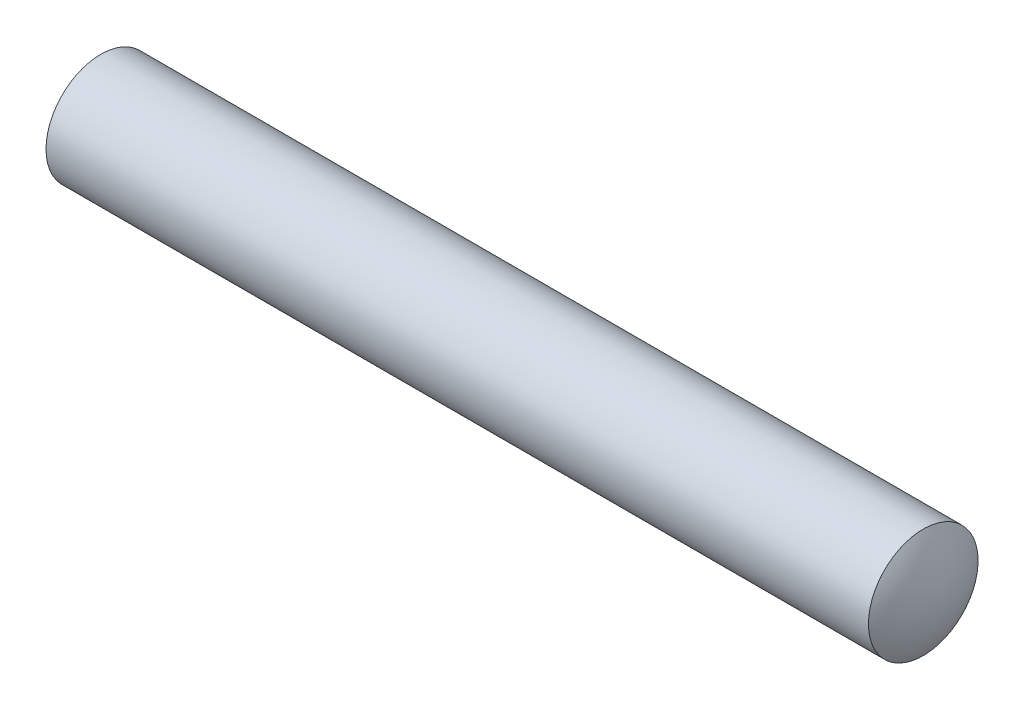
ISO-10303-21;
HEADER;
FILE_DESCRIPTION(('STEP AP214'),'2;1');
FILE_NAME('part.step','',(''),(''),'','','');
FILE_SCHEMA(('AUTOMOTIVE_DESIGN { 1 0 10303 214 1 1 1 1 }'));
ENDSEC;
DATA;
#1=APPLICATION_CONTEXT('core data for automotive mechanical design processes');
#2=APPLICATION_PROTOCOL_DEFINITION('international standard','automotive_design',2000,#1);
#3=PRODUCT_CONTEXT('',#1,'mechanical');
#4=PRODUCT('Part','Part','',(#3));
#5=PRODUCT_RELATED_PRODUCT_CATEGORY('part','',(#4));
#6=PRODUCT_DEFINITION_FORMATION('','',#4);
#7=PRODUCT_DEFINITION_CONTEXT('part definition',#1,'design');
#8=PRODUCT_DEFINITION('design','',#6,#7);
#9=PRODUCT_DEFINITION_SHAPE('','',#8);
#10=(LENGTH_UNIT() NAMED_UNIT(*) SI_UNIT(.MILLI.,.METRE.));
#11=(NAMED_UNIT(*) PLANE_ANGLE_UNIT() SI_UNIT($,.RADIAN.));
#12=(NAMED_UNIT(*) SI_UNIT($,.STERADIAN.) SOLID_ANGLE_UNIT());
#13=UNCERTAINTY_MEASURE_WITH_UNIT(LENGTH_MEASURE(1.E-05),#10,'distance_accuracy_value','');
#14=(GEOMETRIC_REPRESENTATION_CONTEXT(3) GLOBAL_UNCERTAINTY_ASSIGNED_CONTEXT((#13)) GLOBAL_UNIT_ASSIGNED_CONTEXT((#10,
#11,#12)) REPRESENTATION_CONTEXT('',''));
#15=CARTESIAN_POINT('',(0.,0.,0.));
#16=DIRECTION('',(0.,0.,1.));
#17=DIRECTION('',(1.,0.,0.));
#18=AXIS2_PLACEMENT_3D('',#15,#16,#17);
#19=CARTESIAN_POINT('',(3.39849957179514,0.,-0.109549871538541));
#20=DIRECTION('',(0.,-1.,0.));
#21=DIRECTION('',(0.,0.,1.));
#22=AXIS2_PLACEMENT_3D('',#19,#20,#21);
#23=CIRCLE('',#22,4.);
#24=TRIMMED_CURVE('',#23,(PARAMETER_VALUE(-1.5434054339856)),(PARAMETER_VALUE(1.5434054339856)),
.T.,.PARAMETER.);
#25=CARTESIAN_POINT('',(3.39849957179514,0.,0.));
#26=DIRECTION('',(-1.,0.,0.));
#27=AXIS1_PLACEMENT('',#25,#26);
#28=SURFACE_OF_REVOLUTION('',#24,#27);
#29=CARTESIAN_POINT('',(-0.6,0.,0.));
#30=VERTEX_POINT('',#29);
#31=VERTEX_LOOP('',#30);
#32=FACE_BOUND('',#31,.T.);
#33=CARTESIAN_POINT('',(0.,0.,0.));
#34=DIRECTION('',(-1.,0.,0.));
#35=DIRECTION('',(0.,0.,1.));
#36=AXIS2_PLACEMENT_3D('',#33,#34,#35);
#37=CIRCLE('',#36,2.);
#38=CARTESIAN_POINT('',(0.,0.,2.));
#39=VERTEX_POINT('',#38);
#40=EDGE_CURVE('E42',#39,#39,#37,.T.);
#41=ORIENTED_EDGE('',*,*,#40,.T.);
#42=EDGE_LOOP('',(#41));
#43=FACE_BOUND('',#42,.T.);
#44=ADVANCED_FACE('F35',(#32,#43),#28,.T.);
#45=CARTESIAN_POINT('',(26.6015004282049,0.,-0.109549871538546));
#46=DIRECTION('',(0.,-1.,0.));
#47=DIRECTION('',(0.,0.,1.));
#48=AXIS2_PLACEMENT_3D('',#45,#46,#47);
#49=CIRCLE('',#48,4.);
#50=TRIMMED_CURVE('',#49,(PARAMETER_VALUE(-1.5434054339856)),(PARAMETER_VALUE(1.5434054339856)),
.T.,.PARAMETER.);
#51=CARTESIAN_POINT('',(26.6015004282049,0.,0.));
#52=DIRECTION('',(-1.,0.,0.));
#53=AXIS1_PLACEMENT('',#51,#52);
#54=SURFACE_OF_REVOLUTION('',#50,#53);
#55=CARTESIAN_POINT('',(30.,0.,0.));
#56=DIRECTION('',(-1.,0.,0.));
#57=DIRECTION('',(0.,0.,1.));
#58=AXIS2_PLACEMENT_3D('',#55,#56,#57);
#59=CIRCLE('',#58,2.);
#60=CARTESIAN_POINT('',(30.,0.,2.));
#61=VERTEX_POINT('',#60);
#62=EDGE_CURVE('E11',#61,#61,#59,.T.);
#63=ORIENTED_EDGE('',*,*,#62,.F.);
#64=EDGE_LOOP('',(#63));
#65=FACE_BOUND('',#64,.T.);
#66=CARTESIAN_POINT('',(30.6,0.,0.));
#67=VERTEX_POINT('',#66);
#68=VERTEX_LOOP('',#67);
#69=FACE_BOUND('',#68,.T.);
#70=ADVANCED_FACE('F50',(#65,#69),#54,.T.);
#71=CARTESIAN_POINT('',(0.,0.,0.));
#72=DIRECTION('',(-1.,0.,0.));
#73=DIRECTION('',(0.,0.,1.));
#74=AXIS2_PLACEMENT_3D('',#71,#72,#73);
#75=CYLINDRICAL_SURFACE('',#74,2.);
#76=ORIENTED_EDGE('',*,*,#40,.F.);
#77=EDGE_LOOP('',(#76));
#78=FACE_BOUND('',#77,.T.);
#79=ORIENTED_EDGE('',*,*,#62,.T.);
#80=EDGE_LOOP('',(#79));
#81=FACE_BOUND('',#80,.T.);
#82=ADVANCED_FACE('F54',(#78,#81),#75,.T.);
#83=CLOSED_SHELL('',(#44,#70,#82));
#84=MANIFOLD_SOLID_BREP('B2',#83);
#85=ADVANCED_BREP_SHAPE_REPRESENTATION('',(#18,#84),#14);
#86=SHAPE_DEFINITION_REPRESENTATION(#9,#85);
ENDSEC;
END-ISO-10303-21;
